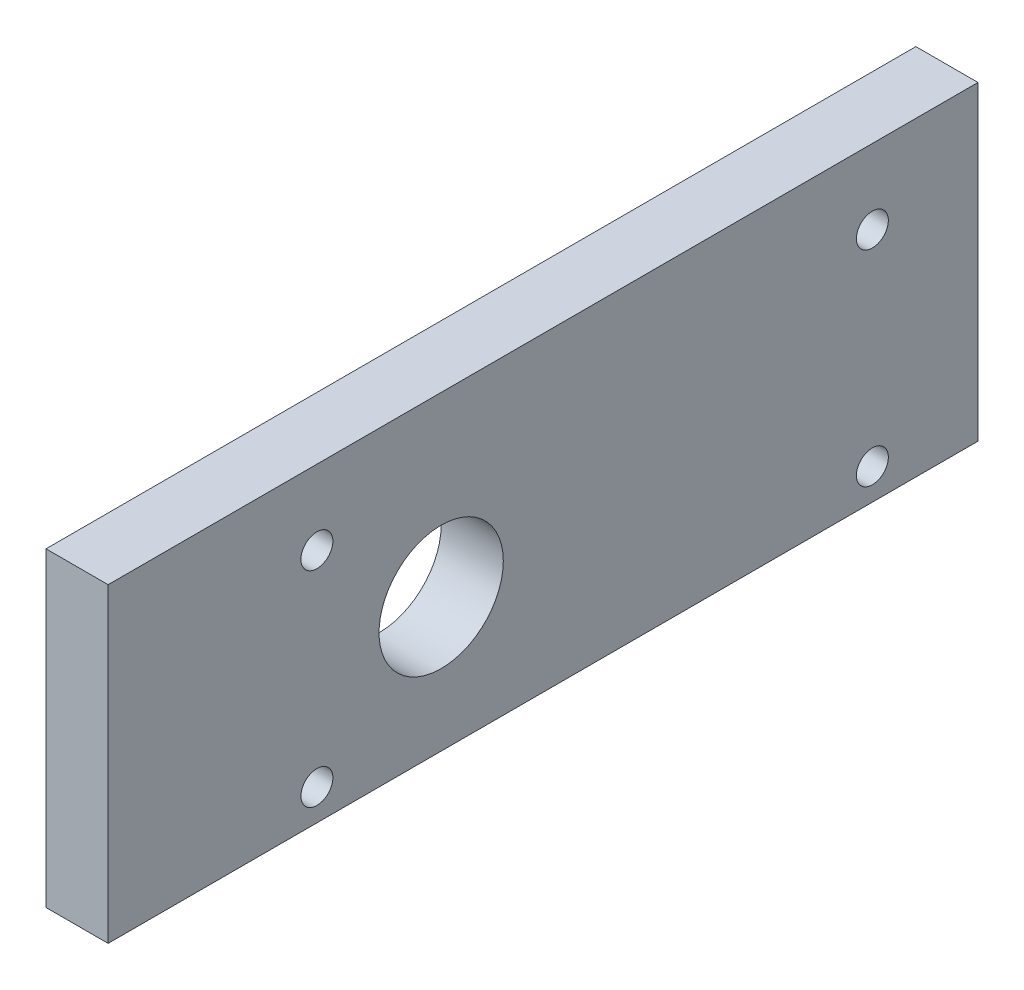
ISO-10303-21;
HEADER;
FILE_DESCRIPTION(('STEP AP214'),'2;1');
FILE_NAME('part.step','',(''),(''),'','','');
FILE_SCHEMA(('AUTOMOTIVE_DESIGN { 1 0 10303 214 1 1 1 1 }'));
ENDSEC;
DATA;
#1=APPLICATION_CONTEXT('core data for automotive mechanical design processes');
#2=APPLICATION_PROTOCOL_DEFINITION('international standard','automotive_design',2000,#1);
#3=PRODUCT_CONTEXT('',#1,'mechanical');
#4=PRODUCT('Part','Part','',(#3));
#5=PRODUCT_RELATED_PRODUCT_CATEGORY('part','',(#4));
#6=PRODUCT_DEFINITION_FORMATION('','',#4);
#7=PRODUCT_DEFINITION_CONTEXT('part definition',#1,'design');
#8=PRODUCT_DEFINITION('design','',#6,#7);
#9=PRODUCT_DEFINITION_SHAPE('','',#8);
#10=(LENGTH_UNIT() NAMED_UNIT(*) SI_UNIT(.MILLI.,.METRE.));
#11=(NAMED_UNIT(*) PLANE_ANGLE_UNIT() SI_UNIT($,.RADIAN.));
#12=(NAMED_UNIT(*) SI_UNIT($,.STERADIAN.) SOLID_ANGLE_UNIT());
#13=UNCERTAINTY_MEASURE_WITH_UNIT(LENGTH_MEASURE(1.E-05),#10,'distance_accuracy_value','');
#14=(GEOMETRIC_REPRESENTATION_CONTEXT(3) GLOBAL_UNCERTAINTY_ASSIGNED_CONTEXT((#13)) GLOBAL_UNIT_ASSIGNED_CONTEXT((#10,
#11,#12)) REPRESENTATION_CONTEXT('',''));
#15=CARTESIAN_POINT('',(0.,0.,0.));
#16=DIRECTION('',(0.,0.,1.));
#17=DIRECTION('',(1.,0.,0.));
#18=AXIS2_PLACEMENT_3D('',#15,#16,#17);
#19=CARTESIAN_POINT('',(3.175,-15.875,-44.45));
#20=DIRECTION('',(0.,0.,1.));
#21=DIRECTION('',(1.,0.,0.));
#22=AXIS2_PLACEMENT_3D('',#19,#20,#21);
#23=PLANE('',#22);
#24=DIRECTION('',(0.,1.,0.));
#25=VECTOR('',#24,1.);
#26=CARTESIAN_POINT('',(-3.175,-15.875,-44.45));
#27=LINE('',#26,#25);
#28=CARTESIAN_POINT('',(-3.175,-15.875,-44.45));
#29=VERTEX_POINT('',#28);
#30=CARTESIAN_POINT('',(-3.175,15.875,-44.45));
#31=VERTEX_POINT('',#30);
#32=EDGE_CURVE('E95',#29,#31,#27,.T.);
#33=ORIENTED_EDGE('',*,*,#32,.T.);
#34=DIRECTION('',(-1.,0.,0.));
#35=VECTOR('',#34,1.);
#36=CARTESIAN_POINT('',(3.175,15.875,-44.45));
#37=LINE('',#36,#35);
#38=CARTESIAN_POINT('',(3.175,15.875,-44.45));
#39=VERTEX_POINT('',#38);
#40=EDGE_CURVE('E11',#39,#31,#37,.T.);
#41=ORIENTED_EDGE('',*,*,#40,.F.);
#42=DIRECTION('',(0.,1.,0.));
#43=VECTOR('',#42,1.);
#44=CARTESIAN_POINT('',(3.175,-15.875,-44.45));
#45=LINE('',#44,#43);
#46=CARTESIAN_POINT('',(3.175,-15.875,-44.45));
#47=VERTEX_POINT('',#46);
#48=EDGE_CURVE('E83',#47,#39,#45,.T.);
#49=ORIENTED_EDGE('',*,*,#48,.F.);
#50=DIRECTION('',(-1.,0.,0.));
#51=VECTOR('',#50,1.);
#52=CARTESIAN_POINT('',(3.175,-15.875,-44.45));
#53=LINE('',#52,#51);
#54=EDGE_CURVE('E91',#47,#29,#53,.T.);
#55=ORIENTED_EDGE('',*,*,#54,.T.);
#56=EDGE_LOOP('',(#33,#41,#49,#55));
#57=FACE_BOUND('',#56,.T.);
#58=ADVANCED_FACE('F32',(#57),#23,.F.);
#59=CARTESIAN_POINT('',(3.175,15.875,44.45));
#60=DIRECTION('',(0.,-1.,0.));
#61=DIRECTION('',(0.,0.,-1.));
#62=AXIS2_PLACEMENT_3D('',#59,#60,#61);
#63=PLANE('',#62);
#64=DIRECTION('',(0.,0.,1.));
#65=VECTOR('',#64,1.);
#66=CARTESIAN_POINT('',(-3.175,15.875,44.45));
#67=LINE('',#66,#65);
#68=CARTESIAN_POINT('',(-3.175,15.875,44.45));
#69=VERTEX_POINT('',#68);
#70=EDGE_CURVE('E87',#31,#69,#67,.T.);
#71=ORIENTED_EDGE('',*,*,#70,.T.);
#72=DIRECTION('',(-1.,0.,0.));
#73=VECTOR('',#72,1.);
#74=CARTESIAN_POINT('',(3.175,15.875,44.45));
#75=LINE('',#74,#73);
#76=CARTESIAN_POINT('',(3.175,15.875,44.45));
#77=VERTEX_POINT('',#76);
#78=EDGE_CURVE('E40',#77,#69,#75,.T.);
#79=ORIENTED_EDGE('',*,*,#78,.F.);
#80=DIRECTION('',(0.,0.,1.));
#81=VECTOR('',#80,1.);
#82=CARTESIAN_POINT('',(3.175,15.875,44.45));
#83=LINE('',#82,#81);
#84=EDGE_CURVE('E78',#39,#77,#83,.T.);
#85=ORIENTED_EDGE('',*,*,#84,.F.);
#86=ORIENTED_EDGE('',*,*,#40,.T.);
#87=EDGE_LOOP('',(#71,#79,#85,#86));
#88=FACE_BOUND('',#87,.T.);
#89=ADVANCED_FACE('F86',(#88),#63,.F.);
#90=CARTESIAN_POINT('',(3.175,-15.875,44.45));
#91=DIRECTION('',(0.,0.,-1.));
#92=DIRECTION('',(-1.,0.,0.));
#93=AXIS2_PLACEMENT_3D('',#90,#91,#92);
#94=PLANE('',#93);
#95=DIRECTION('',(0.,-1.,0.));
#96=VECTOR('',#95,1.);
#97=CARTESIAN_POINT('',(-3.175,-15.875,44.45));
#98=LINE('',#97,#96);
#99=CARTESIAN_POINT('',(-3.175,-15.875,44.45));
#100=VERTEX_POINT('',#99);
#101=EDGE_CURVE('E65',#69,#100,#98,.T.);
#102=ORIENTED_EDGE('',*,*,#101,.T.);
#103=DIRECTION('',(-1.,0.,0.));
#104=VECTOR('',#103,1.);
#105=CARTESIAN_POINT('',(3.175,-15.875,44.45));
#106=LINE('',#105,#104);
#107=CARTESIAN_POINT('',(3.175,-15.875,44.45));
#108=VERTEX_POINT('',#107);
#109=EDGE_CURVE('E88',#108,#100,#106,.T.);
#110=ORIENTED_EDGE('',*,*,#109,.F.);
#111=DIRECTION('',(0.,-1.,0.));
#112=VECTOR('',#111,1.);
#113=CARTESIAN_POINT('',(3.175,-15.875,44.45));
#114=LINE('',#113,#112);
#115=EDGE_CURVE('E81',#77,#108,#114,.T.);
#116=ORIENTED_EDGE('',*,*,#115,.F.);
#117=ORIENTED_EDGE('',*,*,#78,.T.);
#118=EDGE_LOOP('',(#102,#110,#116,#117));
#119=FACE_BOUND('',#118,.T.);
#120=ADVANCED_FACE('F89',(#119),#94,.F.);
#121=CARTESIAN_POINT('',(3.175,-15.875,44.45));
#122=DIRECTION('',(0.,1.,0.));
#123=DIRECTION('',(0.,0.,1.));
#124=AXIS2_PLACEMENT_3D('',#121,#122,#123);
#125=PLANE('',#124);
#126=DIRECTION('',(0.,0.,-1.));
#127=VECTOR('',#126,1.);
#128=CARTESIAN_POINT('',(-3.175,-15.875,44.45));
#129=LINE('',#128,#127);
#130=EDGE_CURVE('E71',#100,#29,#129,.T.);
#131=ORIENTED_EDGE('',*,*,#130,.T.);
#132=ORIENTED_EDGE('',*,*,#54,.F.);
#133=DIRECTION('',(0.,0.,-1.));
#134=VECTOR('',#133,1.);
#135=CARTESIAN_POINT('',(3.175,-15.875,44.45));
#136=LINE('',#135,#134);
#137=EDGE_CURVE('E48',#108,#47,#136,.T.);
#138=ORIENTED_EDGE('',*,*,#137,.F.);
#139=ORIENTED_EDGE('',*,*,#109,.T.);
#140=EDGE_LOOP('',(#131,#132,#138,#139));
#141=FACE_BOUND('',#140,.T.);
#142=ADVANCED_FACE('F103',(#141),#125,.F.);
#143=CARTESIAN_POINT('',(3.175,0.,0.));
#144=DIRECTION('',(-1.,0.,0.));
#145=DIRECTION('',(0.,0.,1.));
#146=AXIS2_PLACEMENT_3D('',#143,#144,#145);
#147=PLANE('',#146);
#148=CARTESIAN_POINT('',(3.175,-2.2225,10.414));
#149=DIRECTION('',(1.,0.,0.));
#150=DIRECTION('',(0.,0.,-1.));
#151=AXIS2_PLACEMENT_3D('',#148,#149,#150);
#152=CIRCLE('',#151,6.35);
#153=CARTESIAN_POINT('',(3.175,-2.2225,4.06399999999999));
#154=VERTEX_POINT('',#153);
#155=EDGE_CURVE('E118',#154,#154,#152,.T.);
#156=ORIENTED_EDGE('',*,*,#155,.F.);
#157=EDGE_LOOP('',(#156));
#158=FACE_BOUND('',#157,.T.);
#159=CARTESIAN_POINT('',(3.175,8.255,23.114));
#160=DIRECTION('',(1.,0.,0.));
#161=DIRECTION('',(0.,0.,-1.));
#162=AXIS2_PLACEMENT_3D('',#159,#160,#161);
#163=CIRCLE('',#162,1.63195);
#164=CARTESIAN_POINT('',(3.175,8.255,21.48205));
#165=VERTEX_POINT('',#164);
#166=EDGE_CURVE('E124',#165,#165,#163,.T.);
#167=ORIENTED_EDGE('',*,*,#166,.F.);
#168=EDGE_LOOP('',(#167));
#169=FACE_BOUND('',#168,.T.);
#170=CARTESIAN_POINT('',(3.175,8.255,-33.655));
#171=DIRECTION('',(1.,0.,0.));
#172=DIRECTION('',(0.,0.,-1.));
#173=AXIS2_PLACEMENT_3D('',#170,#171,#172);
#174=CIRCLE('',#173,1.63195);
#175=CARTESIAN_POINT('',(3.175,8.255,-35.28695));
#176=VERTEX_POINT('',#175);
#177=EDGE_CURVE('E130',#176,#176,#174,.T.);
#178=ORIENTED_EDGE('',*,*,#177,.F.);
#179=EDGE_LOOP('',(#178));
#180=FACE_BOUND('',#179,.T.);
#181=CARTESIAN_POINT('',(3.175,-12.7,-33.655));
#182=DIRECTION('',(1.,0.,0.));
#183=DIRECTION('',(0.,0.,-1.));
#184=AXIS2_PLACEMENT_3D('',#181,#182,#183);
#185=CIRCLE('',#184,1.63195);
#186=CARTESIAN_POINT('',(3.175,-12.7,-35.28695));
#187=VERTEX_POINT('',#186);
#188=EDGE_CURVE('E112',#187,#187,#185,.T.);
#189=ORIENTED_EDGE('',*,*,#188,.F.);
#190=EDGE_LOOP('',(#189));
#191=FACE_BOUND('',#190,.T.);
#192=CARTESIAN_POINT('',(3.175,-12.7,23.114));
#193=DIRECTION('',(1.,0.,0.));
#194=DIRECTION('',(0.,0.,-1.));
#195=AXIS2_PLACEMENT_3D('',#192,#193,#194);
#196=CIRCLE('',#195,1.63195);
#197=CARTESIAN_POINT('',(3.175,-12.7,21.48205));
#198=VERTEX_POINT('',#197);
#199=EDGE_CURVE('E98',#198,#198,#196,.T.);
#200=ORIENTED_EDGE('',*,*,#199,.F.);
#201=EDGE_LOOP('',(#200));
#202=FACE_BOUND('',#201,.T.);
#203=ORIENTED_EDGE('',*,*,#48,.T.);
#204=ORIENTED_EDGE('',*,*,#84,.T.);
#205=ORIENTED_EDGE('',*,*,#115,.T.);
#206=ORIENTED_EDGE('',*,*,#137,.T.);
#207=EDGE_LOOP('',(#203,#204,#205,#206));
#208=FACE_BOUND('',#207,.T.);
#209=ADVANCED_FACE('F79',(#158,#169,#180,#191,#202,#208),#147,.F.);
#210=CARTESIAN_POINT('',(-3.175,0.,0.));
#211=DIRECTION('',(-1.,0.,0.));
#212=DIRECTION('',(0.,0.,1.));
#213=AXIS2_PLACEMENT_3D('',#210,#211,#212);
#214=PLANE('',#213);
#215=CARTESIAN_POINT('',(-3.175,-2.2225,10.414));
#216=DIRECTION('',(-1.,0.,0.));
#217=DIRECTION('',(0.,0.,1.));
#218=AXIS2_PLACEMENT_3D('',#215,#216,#217);
#219=CIRCLE('',#218,6.35);
#220=CARTESIAN_POINT('',(-3.175,-2.2225,16.764));
#221=VERTEX_POINT('',#220);
#222=EDGE_CURVE('E115',#221,#221,#219,.F.);
#223=ORIENTED_EDGE('',*,*,#222,.T.);
#224=EDGE_LOOP('',(#223));
#225=FACE_BOUND('',#224,.T.);
#226=CARTESIAN_POINT('',(-3.175,8.255,23.114));
#227=DIRECTION('',(-1.,0.,0.));
#228=DIRECTION('',(0.,0.,1.));
#229=AXIS2_PLACEMENT_3D('',#226,#227,#228);
#230=CIRCLE('',#229,1.63195);
#231=CARTESIAN_POINT('',(-3.175,8.255,24.74595));
#232=VERTEX_POINT('',#231);
#233=EDGE_CURVE('E121',#232,#232,#230,.F.);
#234=ORIENTED_EDGE('',*,*,#233,.T.);
#235=EDGE_LOOP('',(#234));
#236=FACE_BOUND('',#235,.T.);
#237=CARTESIAN_POINT('',(-3.175,8.255,-33.655));
#238=DIRECTION('',(-1.,0.,0.));
#239=DIRECTION('',(0.,0.,1.));
#240=AXIS2_PLACEMENT_3D('',#237,#238,#239);
#241=CIRCLE('',#240,1.63195);
#242=CARTESIAN_POINT('',(-3.175,8.255,-32.02305));
#243=VERTEX_POINT('',#242);
#244=EDGE_CURVE('E127',#243,#243,#241,.F.);
#245=ORIENTED_EDGE('',*,*,#244,.T.);
#246=EDGE_LOOP('',(#245));
#247=FACE_BOUND('',#246,.T.);
#248=CARTESIAN_POINT('',(-3.175,-12.7,-33.655));
#249=DIRECTION('',(-1.,0.,0.));
#250=DIRECTION('',(0.,0.,1.));
#251=AXIS2_PLACEMENT_3D('',#248,#249,#250);
#252=CIRCLE('',#251,1.63195);
#253=CARTESIAN_POINT('',(-3.175,-12.7,-32.02305));
#254=VERTEX_POINT('',#253);
#255=EDGE_CURVE('E133',#254,#254,#252,.F.);
#256=ORIENTED_EDGE('',*,*,#255,.T.);
#257=EDGE_LOOP('',(#256));
#258=FACE_BOUND('',#257,.T.);
#259=CARTESIAN_POINT('',(-3.175,-12.7,23.114));
#260=DIRECTION('',(-1.,0.,0.));
#261=DIRECTION('',(0.,0.,1.));
#262=AXIS2_PLACEMENT_3D('',#259,#260,#261);
#263=CIRCLE('',#262,1.63195);
#264=CARTESIAN_POINT('',(-3.175,-12.7,24.74595));
#265=VERTEX_POINT('',#264);
#266=EDGE_CURVE('E109',#265,#265,#263,.F.);
#267=ORIENTED_EDGE('',*,*,#266,.T.);
#268=EDGE_LOOP('',(#267));
#269=FACE_BOUND('',#268,.T.);
#270=ORIENTED_EDGE('',*,*,#32,.F.);
#271=ORIENTED_EDGE('',*,*,#130,.F.);
#272=ORIENTED_EDGE('',*,*,#101,.F.);
#273=ORIENTED_EDGE('',*,*,#70,.F.);
#274=EDGE_LOOP('',(#270,#271,#272,#273));
#275=FACE_BOUND('',#274,.T.);
#276=ADVANCED_FACE('F106',(#225,#236,#247,#258,#269,#275),#214,.T.);
#277=CARTESIAN_POINT('',(-3.176,-12.7,23.114));
#278=DIRECTION('',(1.,0.,0.));
#279=DIRECTION('',(0.,0.,-1.));
#280=AXIS2_PLACEMENT_3D('',#277,#278,#279);
#281=CYLINDRICAL_SURFACE('',#280,1.63195);
#282=ORIENTED_EDGE('',*,*,#266,.F.);
#283=EDGE_LOOP('',(#282));
#284=FACE_BOUND('',#283,.T.);
#285=ORIENTED_EDGE('',*,*,#199,.T.);
#286=EDGE_LOOP('',(#285));
#287=FACE_BOUND('',#286,.T.);
#288=ADVANCED_FACE('F147',(#284,#287),#281,.F.);
#289=CARTESIAN_POINT('',(-3.176,-12.7,-33.655));
#290=DIRECTION('',(1.,0.,0.));
#291=DIRECTION('',(0.,0.,-1.));
#292=AXIS2_PLACEMENT_3D('',#289,#290,#291);
#293=CYLINDRICAL_SURFACE('',#292,1.63195);
#294=ORIENTED_EDGE('',*,*,#255,.F.);
#295=EDGE_LOOP('',(#294));
#296=FACE_BOUND('',#295,.T.);
#297=ORIENTED_EDGE('',*,*,#188,.T.);
#298=EDGE_LOOP('',(#297));
#299=FACE_BOUND('',#298,.T.);
#300=ADVANCED_FACE('F139',(#296,#299),#293,.F.);
#301=CARTESIAN_POINT('',(-3.176,8.255,-33.655));
#302=DIRECTION('',(1.,0.,0.));
#303=DIRECTION('',(0.,0.,-1.));
#304=AXIS2_PLACEMENT_3D('',#301,#302,#303);
#305=CYLINDRICAL_SURFACE('',#304,1.63195);
#306=ORIENTED_EDGE('',*,*,#244,.F.);
#307=EDGE_LOOP('',(#306));
#308=FACE_BOUND('',#307,.T.);
#309=ORIENTED_EDGE('',*,*,#177,.T.);
#310=EDGE_LOOP('',(#309));
#311=FACE_BOUND('',#310,.T.);
#312=ADVANCED_FACE('F155',(#308,#311),#305,.F.);
#313=CARTESIAN_POINT('',(-3.176,8.255,23.114));
#314=DIRECTION('',(1.,0.,0.));
#315=DIRECTION('',(0.,0.,-1.));
#316=AXIS2_PLACEMENT_3D('',#313,#314,#315);
#317=CYLINDRICAL_SURFACE('',#316,1.63195);
#318=ORIENTED_EDGE('',*,*,#233,.F.);
#319=EDGE_LOOP('',(#318));
#320=FACE_BOUND('',#319,.T.);
#321=ORIENTED_EDGE('',*,*,#166,.T.);
#322=EDGE_LOOP('',(#321));
#323=FACE_BOUND('',#322,.T.);
#324=ADVANCED_FACE('F212',(#320,#323),#317,.F.);
#325=CARTESIAN_POINT('',(-3.176,-2.2225,10.414));
#326=DIRECTION('',(1.,0.,0.));
#327=DIRECTION('',(0.,0.,-1.));
#328=AXIS2_PLACEMENT_3D('',#325,#326,#327);
#329=CYLINDRICAL_SURFACE('',#328,6.35);
#330=ORIENTED_EDGE('',*,*,#222,.F.);
#331=EDGE_LOOP('',(#330));
#332=FACE_BOUND('',#331,.T.);
#333=ORIENTED_EDGE('',*,*,#155,.T.);
#334=EDGE_LOOP('',(#333));
#335=FACE_BOUND('',#334,.T.);
#336=ADVANCED_FACE('F221',(#332,#335),#329,.F.);
#337=CLOSED_SHELL('',(#58,#89,#120,#142,#209,#276,#288,#300,#312,#324,#336));
#338=MANIFOLD_SOLID_BREP('B2',#337);
#339=ADVANCED_BREP_SHAPE_REPRESENTATION('',(#18,#338),#14);
#340=SHAPE_DEFINITION_REPRESENTATION(#9,#339);
ENDSEC;
END-ISO-10303-21;
